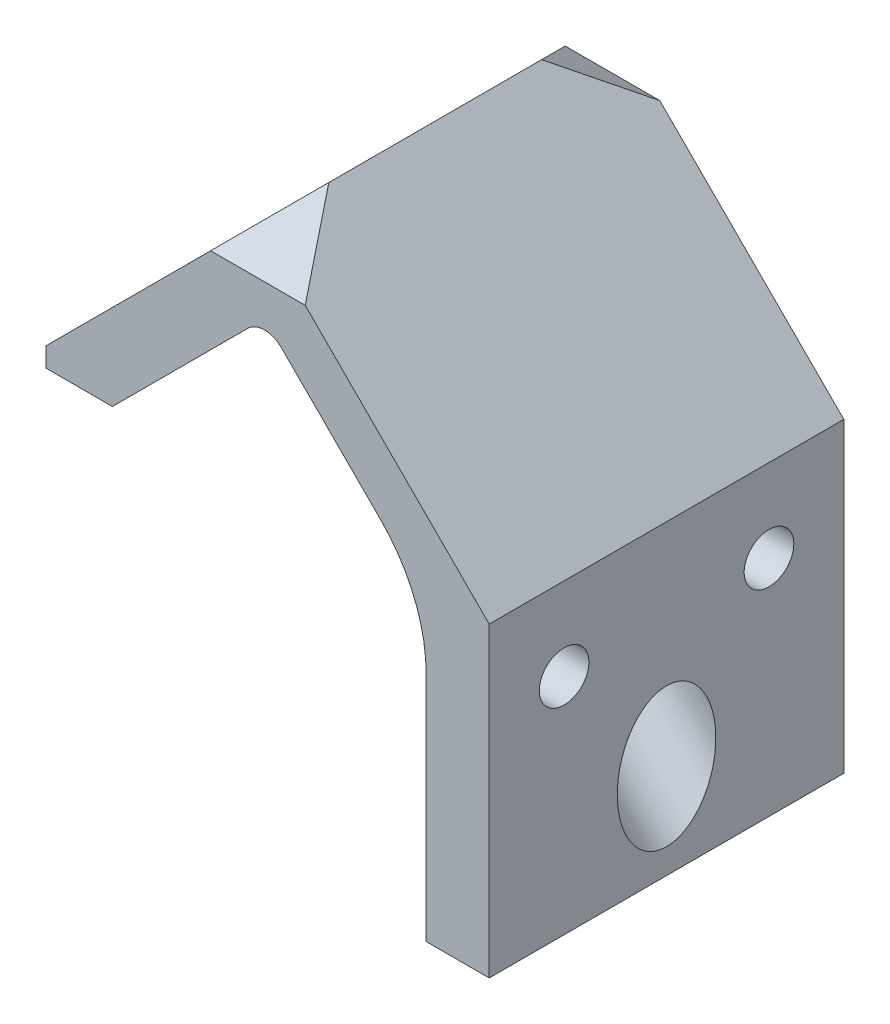
ISO-10303-21;
HEADER;
FILE_DESCRIPTION(('STEP AP214'),'2;1');
FILE_NAME('part.step','',(''),(''),'','','');
FILE_SCHEMA(('AUTOMOTIVE_DESIGN { 1 0 10303 214 1 1 1 1 }'));
ENDSEC;
DATA;
#1=APPLICATION_CONTEXT('core data for automotive mechanical design processes');
#2=APPLICATION_PROTOCOL_DEFINITION('international standard','automotive_design',2000,#1);
#3=PRODUCT_CONTEXT('',#1,'mechanical');
#4=PRODUCT('Part','Part','',(#3));
#5=PRODUCT_RELATED_PRODUCT_CATEGORY('part','',(#4));
#6=PRODUCT_DEFINITION_FORMATION('','',#4);
#7=PRODUCT_DEFINITION_CONTEXT('part definition',#1,'design');
#8=PRODUCT_DEFINITION('design','',#6,#7);
#9=PRODUCT_DEFINITION_SHAPE('','',#8);
#10=(LENGTH_UNIT() NAMED_UNIT(*) SI_UNIT(.MILLI.,.METRE.));
#11=(NAMED_UNIT(*) PLANE_ANGLE_UNIT() SI_UNIT($,.RADIAN.));
#12=(NAMED_UNIT(*) SI_UNIT($,.STERADIAN.) SOLID_ANGLE_UNIT());
#13=UNCERTAINTY_MEASURE_WITH_UNIT(LENGTH_MEASURE(1.E-05),#10,'distance_accuracy_value','');
#14=(GEOMETRIC_REPRESENTATION_CONTEXT(3) GLOBAL_UNCERTAINTY_ASSIGNED_CONTEXT((#13)) GLOBAL_UNIT_ASSIGNED_CONTEXT((#10,
#11,#12)) REPRESENTATION_CONTEXT('',''));
#15=CARTESIAN_POINT('',(0.,0.,0.));
#16=DIRECTION('',(0.,0.,1.));
#17=DIRECTION('',(1.,0.,0.));
#18=AXIS2_PLACEMENT_3D('',#15,#16,#17);
#19=CARTESIAN_POINT('',(-13.8592929112563,-5.25000000000003,4.75));
#20=DIRECTION('',(1.,0.,0.));
#21=DIRECTION('',(0.,1.,0.));
#22=AXIS2_PLACEMENT_3D('',#19,#20,#21);
#23=CYLINDRICAL_SURFACE('',#22,1.575);
#24=CARTESIAN_POINT('',(14.253048327205,-5.25000000000002,4.75));
#25=DIRECTION('',(1.,0.,0.));
#26=DIRECTION('',(0.,1.,0.));
#27=AXIS2_PLACEMENT_3D('',#24,#25,#26);
#28=CIRCLE('',#27,1.575);
#29=CARTESIAN_POINT('',(14.253048327205,-3.67500000000002,4.75));
#30=VERTEX_POINT('',#29);
#31=EDGE_CURVE('E266',#30,#30,#28,.T.);
#32=ORIENTED_EDGE('',*,*,#31,.T.);
#33=EDGE_LOOP('',(#32));
#34=FACE_BOUND('',#33,.T.);
#35=CARTESIAN_POINT('',(11.503048327205,-5.25000000000002,4.75));
#36=DIRECTION('',(-1.,0.,0.));
#37=DIRECTION('',(0.,0.,1.));
#38=AXIS2_PLACEMENT_3D('',#35,#36,#37);
#39=CIRCLE('',#38,1.575);
#40=CARTESIAN_POINT('',(11.503048327205,-5.25000000000002,6.325));
#41=VERTEX_POINT('',#40);
#42=EDGE_CURVE('E262',#41,#41,#39,.F.);
#43=ORIENTED_EDGE('',*,*,#42,.F.);
#44=EDGE_LOOP('',(#43));
#45=FACE_BOUND('',#44,.T.);
#46=ADVANCED_FACE('F35',(#34,#45),#23,.F.);
#47=CARTESIAN_POINT('',(-13.8592929112563,-5.25000000000003,17.75));
#48=DIRECTION('',(1.,0.,0.));
#49=DIRECTION('',(0.,1.,0.));
#50=AXIS2_PLACEMENT_3D('',#47,#48,#49);
#51=CYLINDRICAL_SURFACE('',#50,1.575);
#52=CARTESIAN_POINT('',(14.253048327205,-5.25000000000002,17.75));
#53=DIRECTION('',(1.,0.,0.));
#54=DIRECTION('',(0.,1.,0.));
#55=AXIS2_PLACEMENT_3D('',#52,#53,#54);
#56=CIRCLE('',#55,1.575);
#57=CARTESIAN_POINT('',(14.253048327205,-3.67500000000002,17.75));
#58=VERTEX_POINT('',#57);
#59=EDGE_CURVE('E532',#58,#58,#56,.T.);
#60=ORIENTED_EDGE('',*,*,#59,.T.);
#61=EDGE_LOOP('',(#60));
#62=FACE_BOUND('',#61,.T.);
#63=CARTESIAN_POINT('',(11.503048327205,-5.25000000000002,17.75));
#64=DIRECTION('',(-1.,0.,0.));
#65=DIRECTION('',(0.,0.,1.));
#66=AXIS2_PLACEMENT_3D('',#63,#64,#65);
#67=CIRCLE('',#66,1.575);
#68=CARTESIAN_POINT('',(11.503048327205,-5.25000000000002,19.325));
#69=VERTEX_POINT('',#68);
#70=EDGE_CURVE('E259',#69,#69,#67,.F.);
#71=ORIENTED_EDGE('',*,*,#70,.F.);
#72=EDGE_LOOP('',(#71));
#73=FACE_BOUND('',#72,.T.);
#74=ADVANCED_FACE('F366',(#62,#73),#51,.F.);
#75=CARTESIAN_POINT('',(-13.8592929112563,0.,22.5));
#76=DIRECTION('',(1.,0.,0.));
#77=DIRECTION('',(0.,0.,-1.));
#78=AXIS2_PLACEMENT_3D('',#75,#76,#77);
#79=PLANE('',#78);
#80=DIRECTION('',(0.,-1.,0.));
#81=VECTOR('',#80,1.);
#82=CARTESIAN_POINT('',(-13.8592929112563,0.,0.));
#83=LINE('',#82,#81);
#84=CARTESIAN_POINT('',(-13.8592929112563,1.24228355337243,0.));
#85=VERTEX_POINT('',#84);
#86=CARTESIAN_POINT('',(-13.8592929112563,0.,0.));
#87=VERTEX_POINT('',#86);
#88=EDGE_CURVE('E351',#85,#87,#83,.T.);
#89=ORIENTED_EDGE('',*,*,#88,.T.);
#90=DIRECTION('',(0.,0.,-1.));
#91=VECTOR('',#90,1.);
#92=CARTESIAN_POINT('',(-13.8592929112563,0.,22.5));
#93=LINE('',#92,#91);
#94=CARTESIAN_POINT('',(-13.8592929112563,0.,22.5));
#95=VERTEX_POINT('',#94);
#96=EDGE_CURVE('E255',#95,#87,#93,.T.);
#97=ORIENTED_EDGE('',*,*,#96,.F.);
#98=DIRECTION('',(0.,-1.,0.));
#99=VECTOR('',#98,1.);
#100=CARTESIAN_POINT('',(-13.8592929112563,0.,22.5));
#101=LINE('',#100,#99);
#102=CARTESIAN_POINT('',(-13.8592929112563,1.24228355337243,22.5));
#103=VERTEX_POINT('',#102);
#104=EDGE_CURVE('E327',#103,#95,#101,.T.);
#105=ORIENTED_EDGE('',*,*,#104,.F.);
#106=DIRECTION('',(0.,0.,-1.));
#107=VECTOR('',#106,1.);
#108=CARTESIAN_POINT('',(-13.8592929112563,1.24228355337243,22.5));
#109=LINE('',#108,#107);
#110=EDGE_CURVE('E238',#103,#85,#109,.T.);
#111=ORIENTED_EDGE('',*,*,#110,.T.);
#112=EDGE_LOOP('',(#89,#97,#105,#111));
#113=FACE_BOUND('',#112,.T.);
#114=ADVANCED_FACE('F372',(#113),#79,.F.);
#115=CARTESIAN_POINT('',(-9.65685424949234,0.,22.5));
#116=DIRECTION('',(0.,1.,0.));
#117=DIRECTION('',(-1.,0.,0.));
#118=AXIS2_PLACEMENT_3D('',#115,#116,#117);
#119=PLANE('',#118);
#120=DIRECTION('',(1.,0.,0.));
#121=VECTOR('',#120,1.);
#122=CARTESIAN_POINT('',(-9.65685424949234,0.,0.));
#123=LINE('',#122,#121);
#124=CARTESIAN_POINT('',(-9.65685424949234,0.,0.));
#125=VERTEX_POINT('',#124);
#126=EDGE_CURVE('E318',#87,#125,#123,.T.);
#127=ORIENTED_EDGE('',*,*,#126,.T.);
#128=DIRECTION('',(0.,0.,-1.));
#129=VECTOR('',#128,1.);
#130=CARTESIAN_POINT('',(-9.65685424949234,0.,22.5));
#131=LINE('',#130,#129);
#132=CARTESIAN_POINT('',(-9.65685424949234,0.,22.5));
#133=VERTEX_POINT('',#132);
#134=EDGE_CURVE('E252',#133,#125,#131,.T.);
#135=ORIENTED_EDGE('',*,*,#134,.F.);
#136=DIRECTION('',(1.,0.,0.));
#137=VECTOR('',#136,1.);
#138=CARTESIAN_POINT('',(-9.65685424949234,0.,22.5));
#139=LINE('',#138,#137);
#140=EDGE_CURVE('E329',#95,#133,#139,.T.);
#141=ORIENTED_EDGE('',*,*,#140,.F.);
#142=ORIENTED_EDGE('',*,*,#96,.T.);
#143=EDGE_LOOP('',(#127,#135,#141,#142));
#144=FACE_BOUND('',#143,.T.);
#145=ADVANCED_FACE('F355',(#144),#119,.F.);
#146=CARTESIAN_POINT('',(0.,9.65685424949237,22.5));
#147=DIRECTION('',(-0.707106781186549,0.707106781186546,0.));
#148=DIRECTION('',(-0.707106781186546,-0.707106781186549,0.));
#149=AXIS2_PLACEMENT_3D('',#146,#147,#148);
#150=PLANE('',#149);
#151=CARTESIAN_POINT('',(-4.41941738241592,5.23743686707644,11.25));
#152=DIRECTION('',(-0.707106781186549,0.707106781186546,0.));
#153=DIRECTION('',(-0.707106781186546,-0.707106781186549,0.));
#154=AXIS2_PLACEMENT_3D('',#151,#152,#153);
#155=CIRCLE('',#154,3.125);
#156=CARTESIAN_POINT('',(-6.62912607362387,3.02772817586848,11.25));
#157=VERTEX_POINT('',#156);
#158=EDGE_CURVE('E337',#157,#157,#155,.T.);
#159=ORIENTED_EDGE('',*,*,#158,.T.);
#160=EDGE_LOOP('',(#159));
#161=FACE_BOUND('',#160,.T.);
#162=DIRECTION('',(0.707106781186546,0.707106781186549,0.));
#163=VECTOR('',#162,1.);
#164=CARTESIAN_POINT('',(0.,9.65685424949237,0.));
#165=LINE('',#164,#163);
#166=CARTESIAN_POINT('',(-1.06066017177982,8.59619407771254,0.));
#167=VERTEX_POINT('',#166);
#168=EDGE_CURVE('E314',#125,#167,#165,.T.);
#169=ORIENTED_EDGE('',*,*,#168,.T.);
#170=DIRECTION('',(0.,0.,-1.));
#171=VECTOR('',#170,1.);
#172=CARTESIAN_POINT('',(-1.06066017177982,8.59619407771254,22.5));
#173=LINE('',#172,#171);
#174=CARTESIAN_POINT('',(-1.06066017177982,8.59619407771254,22.5));
#175=VERTEX_POINT('',#174);
#176=EDGE_CURVE('E50',#167,#175,#173,.F.);
#177=ORIENTED_EDGE('',*,*,#176,.T.);
#178=DIRECTION('',(0.707106781186546,0.707106781186549,0.));
#179=VECTOR('',#178,1.);
#180=CARTESIAN_POINT('',(0.,9.65685424949237,22.5));
#181=LINE('',#180,#179);
#182=EDGE_CURVE('E334',#133,#175,#181,.T.);
#183=ORIENTED_EDGE('',*,*,#182,.F.);
#184=ORIENTED_EDGE('',*,*,#134,.T.);
#185=EDGE_LOOP('',(#169,#177,#183,#184));
#186=FACE_BOUND('',#185,.T.);
#187=ADVANCED_FACE('F357',(#161,#186),#150,.F.);
#188=CARTESIAN_POINT('',(10.253048327205,-0.596194077712559,22.5));
#189=DIRECTION('',(0.707106781186546,0.707106781186549,0.));
#190=DIRECTION('',(-0.707106781186549,0.707106781186546,0.));
#191=AXIS2_PLACEMENT_3D('',#188,#189,#190);
#192=PLANE('',#191);
#193=DIRECTION('',(0.707106781186549,-0.707106781186547,0.));
#194=VECTOR('',#193,1.);
#195=CARTESIAN_POINT('',(10.253048327205,-0.596194077712559,22.5));
#196=LINE('',#195,#194);
#197=CARTESIAN_POINT('',(1.06066017177982,8.59619407771255,22.5));
#198=VERTEX_POINT('',#197);
#199=CARTESIAN_POINT('',(7.32411613907041,2.33273811042197,22.5));
#200=VERTEX_POINT('',#199);
#201=EDGE_CURVE('E305',#198,#200,#196,.T.);
#202=ORIENTED_EDGE('',*,*,#201,.F.);
#203=DIRECTION('',(0.,0.,-1.));
#204=VECTOR('',#203,1.);
#205=CARTESIAN_POINT('',(1.06066017177982,8.59619407771255,0.));
#206=LINE('',#205,#204);
#207=CARTESIAN_POINT('',(1.06066017177982,8.59619407771255,0.));
#208=VERTEX_POINT('',#207);
#209=EDGE_CURVE('E297',#198,#208,#206,.T.);
#210=ORIENTED_EDGE('',*,*,#209,.T.);
#211=DIRECTION('',(0.707106781186549,-0.707106781186547,0.));
#212=VECTOR('',#211,1.);
#213=CARTESIAN_POINT('',(10.253048327205,-0.596194077712559,0.));
#214=LINE('',#213,#212);
#215=CARTESIAN_POINT('',(7.32411613907041,2.33273811042197,0.));
#216=VERTEX_POINT('',#215);
#217=EDGE_CURVE('E304',#208,#216,#214,.T.);
#218=ORIENTED_EDGE('',*,*,#217,.T.);
#219=DIRECTION('',(0.,0.,-1.));
#220=VECTOR('',#219,1.);
#221=CARTESIAN_POINT('',(7.32411613907041,2.33273811042197,22.5));
#222=LINE('',#221,#220);
#223=EDGE_CURVE('E273',#216,#200,#222,.F.);
#224=ORIENTED_EDGE('',*,*,#223,.T.);
#225=EDGE_LOOP('',(#202,#210,#218,#224));
#226=FACE_BOUND('',#225,.T.);
#227=ADVANCED_FACE('F303',(#226),#192,.F.);
#228=CARTESIAN_POINT('',(10.2530483272049,-19.4461940777126,22.5));
#229=DIRECTION('',(1.,0.,0.));
#230=DIRECTION('',(0.,1.,0.));
#231=AXIS2_PLACEMENT_3D('',#228,#229,#230);
#232=PLANE('',#231);
#233=DIRECTION('',(0.,-1.,0.));
#234=VECTOR('',#233,1.);
#235=CARTESIAN_POINT('',(10.2530483272049,-19.4461940777126,22.5));
#236=LINE('',#235,#234);
#237=CARTESIAN_POINT('',(10.2530483272049,-4.73832970144353,22.5));
#238=VERTEX_POINT('',#237);
#239=CARTESIAN_POINT('',(10.2530483272049,-19.4461940777126,22.5));
#240=VERTEX_POINT('',#239);
#241=EDGE_CURVE('E342',#238,#240,#236,.T.);
#242=ORIENTED_EDGE('',*,*,#241,.F.);
#243=DIRECTION('',(0.,0.,-1.));
#244=VECTOR('',#243,1.);
#245=CARTESIAN_POINT('',(10.2530483272049,-4.73832970144353,0.));
#246=LINE('',#245,#244);
#247=CARTESIAN_POINT('',(10.253048327205,-4.73832970144353,20.630013495935));
#248=VERTEX_POINT('',#247);
#249=EDGE_CURVE('E270',#238,#248,#246,.T.);
#250=ORIENTED_EDGE('',*,*,#249,.T.);
#251=DIRECTION('',(0.,0.866025403784439,-0.5));
#252=VECTOR('',#251,1.);
#253=CARTESIAN_POINT('',(10.253048327205,-5.25000000000001,20.9254264805429));
#254=LINE('',#253,#252);
#255=CARTESIAN_POINT('',(10.253048327205,-5.25000000000001,20.9254264805429));
#256=VERTEX_POINT('',#255);
#257=EDGE_CURVE('E513',#256,#248,#254,.T.);
#258=ORIENTED_EDGE('',*,*,#257,.F.);
#259=DIRECTION('',(0.,0.866025403784439,0.499999999999999));
#260=VECTOR('',#259,1.);
#261=CARTESIAN_POINT('',(10.253048327205,-8.00000000000002,19.3377132402715));
#262=LINE('',#261,#260);
#263=CARTESIAN_POINT('',(10.2530483272049,-8.00000000000002,19.3377132402715));
#264=VERTEX_POINT('',#263);
#265=EDGE_CURVE('E510',#264,#256,#262,.T.);
#266=ORIENTED_EDGE('',*,*,#265,.F.);
#267=DIRECTION('',(0.,0.,1.));
#268=VECTOR('',#267,1.);
#269=CARTESIAN_POINT('',(10.253048327205,-8.00000000000002,16.1622867597285));
#270=LINE('',#269,#268);
#271=CARTESIAN_POINT('',(10.253048327205,-8.00000000000002,16.1622867597285));
#272=VERTEX_POINT('',#271);
#273=EDGE_CURVE('E444',#272,#264,#270,.T.);
#274=ORIENTED_EDGE('',*,*,#273,.F.);
#275=DIRECTION('',(0.,-0.866025403784439,0.5));
#276=VECTOR('',#275,1.);
#277=CARTESIAN_POINT('',(10.253048327205,-5.25000000000002,14.5745735194571));
#278=LINE('',#277,#276);
#279=CARTESIAN_POINT('',(10.253048327205,-5.25000000000002,14.5745735194571));
#280=VERTEX_POINT('',#279);
#281=EDGE_CURVE('E493',#280,#272,#278,.T.);
#282=ORIENTED_EDGE('',*,*,#281,.F.);
#283=DIRECTION('',(0.,-0.866025403784439,-0.5));
#284=VECTOR('',#283,1.);
#285=CARTESIAN_POINT('',(10.253048327205,-2.50000000000001,16.1622867597285));
#286=LINE('',#285,#284);
#287=CARTESIAN_POINT('',(10.253048327205,-4.73832970144353,14.869986504065));
#288=VERTEX_POINT('',#287);
#289=EDGE_CURVE('E516',#288,#280,#286,.T.);
#290=ORIENTED_EDGE('',*,*,#289,.F.);
#291=DIRECTION('',(0.,0.,-1.));
#292=VECTOR('',#291,1.);
#293=CARTESIAN_POINT('',(10.2530483272049,-4.73832970144353,0.));
#294=LINE('',#293,#292);
#295=CARTESIAN_POINT('',(10.253048327205,-4.73832970144353,7.63001349593502));
#296=VERTEX_POINT('',#295);
#297=EDGE_CURVE('E268',#288,#296,#294,.T.);
#298=ORIENTED_EDGE('',*,*,#297,.T.);
#299=DIRECTION('',(0.,0.866025403784439,-0.5));
#300=VECTOR('',#299,1.);
#301=CARTESIAN_POINT('',(10.253048327205,-5.25000000000001,7.92542648054294));
#302=LINE('',#301,#300);
#303=CARTESIAN_POINT('',(10.253048327205,-5.25000000000001,7.92542648054294));
#304=VERTEX_POINT('',#303);
#305=EDGE_CURVE('E471',#304,#296,#302,.T.);
#306=ORIENTED_EDGE('',*,*,#305,.F.);
#307=DIRECTION('',(0.,0.866025403784439,0.5));
#308=VECTOR('',#307,1.);
#309=CARTESIAN_POINT('',(10.253048327205,-8.00000000000002,6.33771324027147));
#310=LINE('',#309,#308);
#311=CARTESIAN_POINT('',(10.2530483272049,-8.00000000000002,6.33771324027147));
#312=VERTEX_POINT('',#311);
#313=EDGE_CURVE('E467',#312,#304,#310,.T.);
#314=ORIENTED_EDGE('',*,*,#313,.F.);
#315=DIRECTION('',(0.,0.,1.));
#316=VECTOR('',#315,1.);
#317=CARTESIAN_POINT('',(10.253048327205,-8.00000000000002,3.16228675972853));
#318=LINE('',#317,#316);
#319=CARTESIAN_POINT('',(10.253048327205,-8.00000000000002,3.16228675972853));
#320=VERTEX_POINT('',#319);
#321=EDGE_CURVE('E465',#320,#312,#318,.T.);
#322=ORIENTED_EDGE('',*,*,#321,.F.);
#323=DIRECTION('',(0.,-0.866025403784439,0.5));
#324=VECTOR('',#323,1.);
#325=CARTESIAN_POINT('',(10.253048327205,-5.25000000000001,1.57457351945706));
#326=LINE('',#325,#324);
#327=CARTESIAN_POINT('',(10.253048327205,-5.25000000000001,1.57457351945706));
#328=VERTEX_POINT('',#327);
#329=EDGE_CURVE('E449',#328,#320,#326,.T.);
#330=ORIENTED_EDGE('',*,*,#329,.F.);
#331=DIRECTION('',(0.,-0.866025403784439,-0.5));
#332=VECTOR('',#331,1.);
#333=CARTESIAN_POINT('',(10.253048327205,-2.50000000000001,3.16228675972853));
#334=LINE('',#333,#332);
#335=CARTESIAN_POINT('',(10.253048327205,-4.73832970144353,1.86998650406498));
#336=VERTEX_POINT('',#335);
#337=EDGE_CURVE('E436',#336,#328,#334,.T.);
#338=ORIENTED_EDGE('',*,*,#337,.F.);
#339=DIRECTION('',(0.,0.,-1.));
#340=VECTOR('',#339,1.);
#341=CARTESIAN_POINT('',(10.2530483272049,-4.73832970144353,0.));
#342=LINE('',#341,#340);
#343=CARTESIAN_POINT('',(10.2530483272049,-4.73832970144353,0.));
#344=VERTEX_POINT('',#343);
#345=EDGE_CURVE('E258',#336,#344,#342,.T.);
#346=ORIENTED_EDGE('',*,*,#345,.T.);
#347=DIRECTION('',(0.,-1.,0.));
#348=VECTOR('',#347,1.);
#349=CARTESIAN_POINT('',(10.2530483272049,-19.4461940777126,0.));
#350=LINE('',#349,#348);
#351=CARTESIAN_POINT('',(10.2530483272049,-19.4461940777126,0.));
#352=VERTEX_POINT('',#351);
#353=EDGE_CURVE('E313',#344,#352,#350,.T.);
#354=ORIENTED_EDGE('',*,*,#353,.T.);
#355=DIRECTION('',(0.,0.,-1.));
#356=VECTOR('',#355,1.);
#357=CARTESIAN_POINT('',(10.2530483272049,-19.4461940777126,22.5));
#358=LINE('',#357,#356);
#359=EDGE_CURVE('E249',#240,#352,#358,.T.);
#360=ORIENTED_EDGE('',*,*,#359,.F.);
#361=EDGE_LOOP('',(#242,#250,#258,#266,#274,#282,#290,#298,#306,#314,#322,#330,#338,#346,#354,#360));
#362=FACE_BOUND('',#361,.T.);
#363=CARTESIAN_POINT('',(10.2530483272049,-9.43502884254437,11.25));
#364=DIRECTION('',(1.,0.,0.));
#365=DIRECTION('',(0.,1.,0.));
#366=AXIS2_PLACEMENT_3D('',#363,#364,#365);
#367=ELLIPSE('',#366,4.41941738241591,3.125);
#368=CARTESIAN_POINT('',(10.2530483272049,-5.01561146012847,11.25));
#369=VERTEX_POINT('',#368);
#370=EDGE_CURVE('E541',#369,#369,#367,.T.);
#371=ORIENTED_EDGE('',*,*,#370,.T.);
#372=EDGE_LOOP('',(#371));
#373=FACE_BOUND('',#372,.T.);
#374=ADVANCED_FACE('F400',(#362,#373),#232,.F.);
#375=CARTESIAN_POINT('',(14.2530483272049,-19.4461940777126,22.5));
#376=DIRECTION('',(0.,1.,0.));
#377=DIRECTION('',(0.,0.,1.));
#378=AXIS2_PLACEMENT_3D('',#375,#376,#377);
#379=PLANE('',#378);
#380=DIRECTION('',(1.,0.,0.));
#381=VECTOR('',#380,1.);
#382=CARTESIAN_POINT('',(14.2530483272049,-19.4461940777126,0.));
#383=LINE('',#382,#381);
#384=CARTESIAN_POINT('',(14.2530483272049,-19.4461940777126,0.));
#385=VERTEX_POINT('',#384);
#386=EDGE_CURVE('E316',#352,#385,#383,.T.);
#387=ORIENTED_EDGE('',*,*,#386,.T.);
#388=DIRECTION('',(0.,0.,-1.));
#389=VECTOR('',#388,1.);
#390=CARTESIAN_POINT('',(14.2530483272049,-19.4461940777126,22.5));
#391=LINE('',#390,#389);
#392=CARTESIAN_POINT('',(14.2530483272049,-19.4461940777126,22.5));
#393=VERTEX_POINT('',#392);
#394=EDGE_CURVE('E241',#393,#385,#391,.T.);
#395=ORIENTED_EDGE('',*,*,#394,.F.);
#396=DIRECTION('',(1.,0.,0.));
#397=VECTOR('',#396,1.);
#398=CARTESIAN_POINT('',(14.2530483272049,-19.4461940777126,22.5));
#399=LINE('',#398,#397);
#400=EDGE_CURVE('E344',#240,#393,#399,.T.);
#401=ORIENTED_EDGE('',*,*,#400,.F.);
#402=ORIENTED_EDGE('',*,*,#359,.T.);
#403=EDGE_LOOP('',(#387,#395,#401,#402));
#404=FACE_BOUND('',#403,.T.);
#405=ADVANCED_FACE('F396',(#404),#379,.F.);
#406=CARTESIAN_POINT('',(14.253048327205,0.,22.5));
#407=DIRECTION('',(-1.,0.,0.));
#408=DIRECTION('',(0.,-1.,0.));
#409=AXIS2_PLACEMENT_3D('',#406,#407,#408);
#410=PLANE('',#409);
#411=ORIENTED_EDGE('',*,*,#59,.F.);
#412=EDGE_LOOP('',(#411));
#413=FACE_BOUND('',#412,.T.);
#414=ORIENTED_EDGE('',*,*,#31,.F.);
#415=EDGE_LOOP('',(#414));
#416=FACE_BOUND('',#415,.T.);
#417=CARTESIAN_POINT('',(14.2530483272049,-13.4350288425444,11.25));
#418=DIRECTION('',(-1.,0.,0.));
#419=DIRECTION('',(0.,1.,0.));
#420=AXIS2_PLACEMENT_3D('',#417,#418,#419);
#421=ELLIPSE('',#420,4.41941738241591,3.125);
#422=CARTESIAN_POINT('',(14.2530483272049,-9.01561146012845,11.25));
#423=VERTEX_POINT('',#422);
#424=EDGE_CURVE('E539',#423,#423,#421,.T.);
#425=ORIENTED_EDGE('',*,*,#424,.T.);
#426=EDGE_LOOP('',(#425));
#427=FACE_BOUND('',#426,.T.);
#428=DIRECTION('',(0.,1.,0.));
#429=VECTOR('',#428,1.);
#430=CARTESIAN_POINT('',(14.253048327205,0.,0.));
#431=LINE('',#430,#429);
#432=CARTESIAN_POINT('',(14.253048327205,0.,0.));
#433=VERTEX_POINT('',#432);
#434=EDGE_CURVE('E323',#385,#433,#431,.T.);
#435=ORIENTED_EDGE('',*,*,#434,.T.);
#436=DIRECTION('',(0.,0.,-1.));
#437=VECTOR('',#436,1.);
#438=CARTESIAN_POINT('',(14.253048327205,0.,22.5));
#439=LINE('',#438,#437);
#440=CARTESIAN_POINT('',(14.253048327205,0.,22.5));
#441=VERTEX_POINT('',#440);
#442=EDGE_CURVE('E237',#441,#433,#439,.T.);
#443=ORIENTED_EDGE('',*,*,#442,.F.);
#444=DIRECTION('',(0.,1.,0.));
#445=VECTOR('',#444,1.);
#446=CARTESIAN_POINT('',(14.253048327205,0.,22.5));
#447=LINE('',#446,#445);
#448=EDGE_CURVE('E346',#393,#441,#447,.T.);
#449=ORIENTED_EDGE('',*,*,#448,.F.);
#450=ORIENTED_EDGE('',*,*,#394,.T.);
#451=EDGE_LOOP('',(#435,#443,#449,#450));
#452=FACE_BOUND('',#451,.T.);
#453=ADVANCED_FACE('F393',(#413,#416,#427,#452),#410,.F.);
#454=CARTESIAN_POINT('',(-0.424264068711931,14.6773123959169,22.5));
#455=DIRECTION('',(-0.707106781186547,-0.707106781186548,0.));
#456=DIRECTION('',(0.707106781186548,-0.707106781186547,0.));
#457=AXIS2_PLACEMENT_3D('',#454,#455,#456);
#458=PLANE('',#457);
#459=DIRECTION('',(0.,0.,-1.));
#460=VECTOR('',#459,1.);
#461=CARTESIAN_POINT('',(-0.424264068711931,14.6773123959169,22.5));
#462=LINE('',#461,#460);
#463=CARTESIAN_POINT('',(-0.424264068711939,14.6773123959169,18.));
#464=VERTEX_POINT('',#463);
#465=CARTESIAN_POINT('',(-0.424264068711939,14.6773123959169,4.5));
#466=VERTEX_POINT('',#465);
#467=EDGE_CURVE('E228',#464,#466,#462,.T.);
#468=ORIENTED_EDGE('',*,*,#467,.F.);
#469=DIRECTION('',(-0.485071250072671,0.485071250072665,-0.727606875108997));
#470=VECTOR('',#469,1.);
#471=CARTESIAN_POINT('',(-0.424264068711939,14.6773123959169,18.));
#472=LINE('',#471,#470);
#473=CARTESIAN_POINT('',(2.5757359312881,11.6773123959169,22.5));
#474=VERTEX_POINT('',#473);
#475=EDGE_CURVE('E213',#474,#464,#472,.T.);
#476=ORIENTED_EDGE('',*,*,#475,.F.);
#477=DIRECTION('',(-0.707106781186548,0.707106781186547,0.));
#478=VECTOR('',#477,1.);
#479=CARTESIAN_POINT('',(-0.424264068711931,14.6773123959169,22.5));
#480=LINE('',#479,#478);
#481=EDGE_CURVE('E348',#441,#474,#480,.T.);
#482=ORIENTED_EDGE('',*,*,#481,.F.);
#483=ORIENTED_EDGE('',*,*,#442,.T.);
#484=DIRECTION('',(-0.707106781186548,0.707106781186547,0.));
#485=VECTOR('',#484,1.);
#486=CARTESIAN_POINT('',(-0.424264068711931,14.6773123959169,0.));
#487=LINE('',#486,#485);
#488=CARTESIAN_POINT('',(2.57573593128807,11.6773123959169,0.));
#489=VERTEX_POINT('',#488);
#490=EDGE_CURVE('E325',#433,#489,#487,.T.);
#491=ORIENTED_EDGE('',*,*,#490,.T.);
#492=DIRECTION('',(-0.485071250072671,0.485071250072665,0.727606875108997));
#493=VECTOR('',#492,1.);
#494=CARTESIAN_POINT('',(-0.424264068711939,14.6773123959169,4.5));
#495=LINE('',#494,#493);
#496=EDGE_CURVE('E236',#489,#466,#495,.T.);
#497=ORIENTED_EDGE('',*,*,#496,.T.);
#498=EDGE_LOOP('',(#468,#476,#482,#483,#491,#497));
#499=FACE_BOUND('',#498,.T.);
#500=ADVANCED_FACE('F234',(#499),#458,.F.);
#501=CARTESIAN_POINT('',(-13.8592929112563,1.24228355337243,22.5));
#502=DIRECTION('',(0.707106781186549,-0.707106781186546,0.));
#503=DIRECTION('',(0.707106781186546,0.707106781186549,0.));
#504=AXIS2_PLACEMENT_3D('',#501,#502,#503);
#505=PLANE('',#504);
#506=CARTESIAN_POINT('',(-7.14177848998413,7.95979797464465,11.25));
#507=DIRECTION('',(-0.707106781186549,0.707106781186546,0.));
#508=DIRECTION('',(-0.707106781186546,-0.707106781186549,0.));
#509=AXIS2_PLACEMENT_3D('',#506,#507,#508);
#510=CIRCLE('',#509,3.125);
#511=CARTESIAN_POINT('',(-9.35148718119208,5.75008928343668,11.25));
#512=VERTEX_POINT('',#511);
#513=EDGE_CURVE('E535',#512,#512,#510,.T.);
#514=ORIENTED_EDGE('',*,*,#513,.F.);
#515=EDGE_LOOP('',(#514));
#516=FACE_BOUND('',#515,.T.);
#517=DIRECTION('',(-0.707106781186546,-0.707106781186549,0.));
#518=VECTOR('',#517,1.);
#519=CARTESIAN_POINT('',(-13.8592929112563,1.24228355337243,22.5));
#520=LINE('',#519,#518);
#521=CARTESIAN_POINT('',(-3.42426406871191,11.6773123959169,22.5));
#522=VERTEX_POINT('',#521);
#523=EDGE_CURVE('E231',#522,#103,#520,.T.);
#524=ORIENTED_EDGE('',*,*,#523,.F.);
#525=DIRECTION('',(-0.485071250072665,-0.485071250072666,0.727606875108999));
#526=VECTOR('',#525,1.);
#527=CARTESIAN_POINT('',(-3.42426406871193,11.6773123959169,22.5));
#528=LINE('',#527,#526);
#529=EDGE_CURVE('E216',#464,#522,#528,.T.);
#530=ORIENTED_EDGE('',*,*,#529,.F.);
#531=ORIENTED_EDGE('',*,*,#467,.T.);
#532=DIRECTION('',(-0.485071250072665,-0.485071250072666,-0.727606875108999));
#533=VECTOR('',#532,1.);
#534=CARTESIAN_POINT('',(-3.42426406871193,11.6773123959169,0.));
#535=LINE('',#534,#533);
#536=CARTESIAN_POINT('',(-3.42426406871193,11.6773123959169,0.));
#537=VERTEX_POINT('',#536);
#538=EDGE_CURVE('E421',#466,#537,#535,.T.);
#539=ORIENTED_EDGE('',*,*,#538,.T.);
#540=DIRECTION('',(-0.707106781186546,-0.707106781186549,0.));
#541=VECTOR('',#540,1.);
#542=CARTESIAN_POINT('',(-13.8592929112563,1.24228355337243,0.));
#543=LINE('',#542,#541);
#544=EDGE_CURVE('E326',#537,#85,#543,.T.);
#545=ORIENTED_EDGE('',*,*,#544,.T.);
#546=ORIENTED_EDGE('',*,*,#110,.F.);
#547=EDGE_LOOP('',(#524,#530,#531,#539,#545,#546));
#548=FACE_BOUND('',#547,.T.);
#549=ADVANCED_FACE('F226',(#516,#548),#505,.F.);
#550=CARTESIAN_POINT('',(0.,0.,22.5));
#551=DIRECTION('',(0.,0.,1.));
#552=DIRECTION('',(1.,0.,0.));
#553=AXIS2_PLACEMENT_3D('',#550,#551,#552);
#554=PLANE('',#553);
#555=DIRECTION('',(1.,0.,0.));
#556=VECTOR('',#555,1.);
#557=CARTESIAN_POINT('',(2.5757359312881,11.6773123959169,22.5));
#558=LINE('',#557,#556);
#559=EDGE_CURVE('E218',#522,#474,#558,.T.);
#560=ORIENTED_EDGE('',*,*,#559,.F.);
#561=ORIENTED_EDGE('',*,*,#523,.T.);
#562=ORIENTED_EDGE('',*,*,#104,.T.);
#563=ORIENTED_EDGE('',*,*,#140,.T.);
#564=ORIENTED_EDGE('',*,*,#182,.T.);
#565=CARTESIAN_POINT('',(0.,7.53553390593273,22.5));
#566=DIRECTION('',(0.,0.,1.));
#567=DIRECTION('',(1.,0.,0.));
#568=AXIS2_PLACEMENT_3D('',#565,#566,#567);
#569=CIRCLE('',#568,1.5);
#570=EDGE_CURVE('E11',#175,#198,#569,.F.);
#571=ORIENTED_EDGE('',*,*,#570,.T.);
#572=ORIENTED_EDGE('',*,*,#201,.T.);
#573=CARTESIAN_POINT('',(0.25304832720495,-4.73832970144351,22.5));
#574=DIRECTION('',(0.,0.,1.));
#575=DIRECTION('',(1.,0.,0.));
#576=AXIS2_PLACEMENT_3D('',#573,#574,#575);
#577=CIRCLE('',#576,10.);
#578=EDGE_CURVE('E295',#200,#238,#577,.F.);
#579=ORIENTED_EDGE('',*,*,#578,.T.);
#580=ORIENTED_EDGE('',*,*,#241,.T.);
#581=ORIENTED_EDGE('',*,*,#400,.T.);
#582=ORIENTED_EDGE('',*,*,#448,.T.);
#583=ORIENTED_EDGE('',*,*,#481,.T.);
#584=EDGE_LOOP('',(#560,#561,#562,#563,#564,#571,#572,#579,#580,#581,#582,#583));
#585=FACE_BOUND('',#584,.T.);
#586=ADVANCED_FACE('F358',(#585),#554,.T.);
#587=CARTESIAN_POINT('',(0.,0.,0.));
#588=DIRECTION('',(0.,0.,1.));
#589=DIRECTION('',(1.,0.,0.));
#590=AXIS2_PLACEMENT_3D('',#587,#588,#589);
#591=PLANE('',#590);
#592=ORIENTED_EDGE('',*,*,#544,.F.);
#593=DIRECTION('',(1.,0.,0.));
#594=VECTOR('',#593,1.);
#595=CARTESIAN_POINT('',(2.5757359312881,11.6773123959169,0.));
#596=LINE('',#595,#594);
#597=EDGE_CURVE('E418',#537,#489,#596,.T.);
#598=ORIENTED_EDGE('',*,*,#597,.T.);
#599=ORIENTED_EDGE('',*,*,#490,.F.);
#600=ORIENTED_EDGE('',*,*,#434,.F.);
#601=ORIENTED_EDGE('',*,*,#386,.F.);
#602=ORIENTED_EDGE('',*,*,#353,.F.);
#603=CARTESIAN_POINT('',(0.25304832720495,-4.73832970144351,0.));
#604=DIRECTION('',(0.,0.,1.));
#605=DIRECTION('',(1.,0.,0.));
#606=AXIS2_PLACEMENT_3D('',#603,#604,#605);
#607=CIRCLE('',#606,10.);
#608=EDGE_CURVE('E292',#344,#216,#607,.T.);
#609=ORIENTED_EDGE('',*,*,#608,.T.);
#610=ORIENTED_EDGE('',*,*,#217,.F.);
#611=CARTESIAN_POINT('',(0.,7.53553390593273,0.));
#612=DIRECTION('',(0.,0.,1.));
#613=DIRECTION('',(1.,0.,0.));
#614=AXIS2_PLACEMENT_3D('',#611,#612,#613);
#615=CIRCLE('',#614,1.5);
#616=EDGE_CURVE('E43',#208,#167,#615,.T.);
#617=ORIENTED_EDGE('',*,*,#616,.T.);
#618=ORIENTED_EDGE('',*,*,#168,.F.);
#619=ORIENTED_EDGE('',*,*,#126,.F.);
#620=ORIENTED_EDGE('',*,*,#88,.F.);
#621=EDGE_LOOP('',(#592,#598,#599,#600,#601,#602,#609,#610,#617,#618,#619,#620));
#622=FACE_BOUND('',#621,.T.);
#623=ADVANCED_FACE('F309',(#622),#591,.F.);
#624=CARTESIAN_POINT('',(17.258630944789,-16.4406114601285,11.25));
#625=DIRECTION('',(-0.707106781186549,0.707106781186547,0.));
#626=DIRECTION('',(-0.707106781186546,-0.707106781186549,0.));
#627=AXIS2_PLACEMENT_3D('',#624,#625,#626);
#628=CYLINDRICAL_SURFACE('',#627,3.125);
#629=ORIENTED_EDGE('',*,*,#513,.T.);
#630=EDGE_LOOP('',(#629));
#631=FACE_BOUND('',#630,.T.);
#632=ORIENTED_EDGE('',*,*,#158,.F.);
#633=EDGE_LOOP('',(#632));
#634=FACE_BOUND('',#633,.T.);
#635=ADVANCED_FACE('F379',(#631,#634),#628,.F.);
#636=ORIENTED_EDGE('',*,*,#424,.F.);
#637=EDGE_LOOP('',(#636));
#638=FACE_BOUND('',#637,.T.);
#639=ORIENTED_EDGE('',*,*,#370,.F.);
#640=EDGE_LOOP('',(#639));
#641=FACE_BOUND('',#640,.T.);
#642=ADVANCED_FACE('F382',(#638,#641),#628,.F.);
#643=CARTESIAN_POINT('',(11.503048327205,0.,0.));
#644=DIRECTION('',(-1.,0.,0.));
#645=DIRECTION('',(0.,0.,1.));
#646=AXIS2_PLACEMENT_3D('',#643,#644,#645);
#647=PLANE('',#646);
#648=DIRECTION('',(0.,0.,1.));
#649=VECTOR('',#648,1.);
#650=CARTESIAN_POINT('',(11.503048327205,-8.00000000000002,16.1622867597285));
#651=LINE('',#650,#649);
#652=CARTESIAN_POINT('',(11.503048327205,-8.00000000000002,16.1622867597285));
#653=VERTEX_POINT('',#652);
#654=CARTESIAN_POINT('',(11.503048327205,-8.00000000000002,19.3377132402715));
#655=VERTEX_POINT('',#654);
#656=EDGE_CURVE('E489',#653,#655,#651,.T.);
#657=ORIENTED_EDGE('',*,*,#656,.T.);
#658=DIRECTION('',(0.,0.866025403784439,0.499999999999999));
#659=VECTOR('',#658,1.);
#660=CARTESIAN_POINT('',(11.503048327205,-8.00000000000002,19.3377132402715));
#661=LINE('',#660,#659);
#662=CARTESIAN_POINT('',(11.503048327205,-5.25000000000001,20.9254264805429));
#663=VERTEX_POINT('',#662);
#664=EDGE_CURVE('E492',#655,#663,#661,.T.);
#665=ORIENTED_EDGE('',*,*,#664,.T.);
#666=DIRECTION('',(0.,0.866025403784439,-0.5));
#667=VECTOR('',#666,1.);
#668=CARTESIAN_POINT('',(11.503048327205,-5.25000000000001,20.9254264805429));
#669=LINE('',#668,#667);
#670=CARTESIAN_POINT('',(11.503048327205,-2.50000000000001,19.3377132402715));
#671=VERTEX_POINT('',#670);
#672=EDGE_CURVE('E496',#663,#671,#669,.T.);
#673=ORIENTED_EDGE('',*,*,#672,.T.);
#674=DIRECTION('',(0.,0.,-1.));
#675=VECTOR('',#674,1.);
#676=CARTESIAN_POINT('',(11.503048327205,-2.50000000000001,19.3377132402715));
#677=LINE('',#676,#675);
#678=CARTESIAN_POINT('',(11.503048327205,-2.50000000000001,16.1622867597285));
#679=VERTEX_POINT('',#678);
#680=EDGE_CURVE('E499',#671,#679,#677,.T.);
#681=ORIENTED_EDGE('',*,*,#680,.T.);
#682=DIRECTION('',(0.,-0.866025403784439,-0.5));
#683=VECTOR('',#682,1.);
#684=CARTESIAN_POINT('',(11.503048327205,-2.50000000000001,16.1622867597285));
#685=LINE('',#684,#683);
#686=CARTESIAN_POINT('',(11.503048327205,-5.25000000000002,14.5745735194571));
#687=VERTEX_POINT('',#686);
#688=EDGE_CURVE('E502',#679,#687,#685,.T.);
#689=ORIENTED_EDGE('',*,*,#688,.T.);
#690=DIRECTION('',(0.,-0.866025403784439,0.5));
#691=VECTOR('',#690,1.);
#692=CARTESIAN_POINT('',(11.503048327205,-5.25000000000002,14.5745735194571));
#693=LINE('',#692,#691);
#694=EDGE_CURVE('E505',#687,#653,#693,.T.);
#695=ORIENTED_EDGE('',*,*,#694,.T.);
#696=EDGE_LOOP('',(#657,#665,#673,#681,#689,#695));
#697=FACE_BOUND('',#696,.T.);
#698=ORIENTED_EDGE('',*,*,#70,.T.);
#699=EDGE_LOOP('',(#698));
#700=FACE_BOUND('',#699,.T.);
#701=ADVANCED_FACE('F549',(#697,#700),#647,.T.);
#702=CARTESIAN_POINT('',(11.503048327205,-8.00000000000002,16.1622867597285));
#703=DIRECTION('',(0.,-1.,0.));
#704=DIRECTION('',(0.,0.,-1.));
#705=AXIS2_PLACEMENT_3D('',#702,#703,#704);
#706=PLANE('',#705);
#707=ORIENTED_EDGE('',*,*,#273,.T.);
#708=DIRECTION('',(-1.,0.,0.));
#709=VECTOR('',#708,1.);
#710=CARTESIAN_POINT('',(11.503048327205,-8.00000000000002,19.3377132402715));
#711=LINE('',#710,#709);
#712=EDGE_CURVE('E508',#655,#264,#711,.T.);
#713=ORIENTED_EDGE('',*,*,#712,.F.);
#714=ORIENTED_EDGE('',*,*,#656,.F.);
#715=DIRECTION('',(-1.,0.,0.));
#716=VECTOR('',#715,1.);
#717=CARTESIAN_POINT('',(11.503048327205,-8.00000000000002,16.1622867597285));
#718=LINE('',#717,#716);
#719=EDGE_CURVE('E468',#653,#272,#718,.T.);
#720=ORIENTED_EDGE('',*,*,#719,.T.);
#721=EDGE_LOOP('',(#707,#713,#714,#720));
#722=FACE_BOUND('',#721,.T.);
#723=ADVANCED_FACE('F554',(#722),#706,.F.);
#724=CARTESIAN_POINT('',(11.503048327205,-5.25000000000002,14.5745735194571));
#725=DIRECTION('',(0.,-0.5,-0.866025403784439));
#726=DIRECTION('',(0.,0.866025403784439,-0.5));
#727=AXIS2_PLACEMENT_3D('',#724,#725,#726);
#728=PLANE('',#727);
#729=ORIENTED_EDGE('',*,*,#281,.T.);
#730=ORIENTED_EDGE('',*,*,#719,.F.);
#731=ORIENTED_EDGE('',*,*,#694,.F.);
#732=DIRECTION('',(-1.,0.,0.));
#733=VECTOR('',#732,1.);
#734=CARTESIAN_POINT('',(11.503048327205,-5.25000000000002,14.5745735194571));
#735=LINE('',#734,#733);
#736=EDGE_CURVE('E521',#687,#280,#735,.T.);
#737=ORIENTED_EDGE('',*,*,#736,.T.);
#738=EDGE_LOOP('',(#729,#730,#731,#737));
#739=FACE_BOUND('',#738,.T.);
#740=ADVANCED_FACE('F562',(#739),#728,.F.);
#741=CARTESIAN_POINT('',(11.503048327205,-2.50000000000001,16.1622867597285));
#742=DIRECTION('',(0.,0.5,-0.866025403784439));
#743=DIRECTION('',(0.,0.866025403784439,0.5));
#744=AXIS2_PLACEMENT_3D('',#741,#742,#743);
#745=PLANE('',#744);
#746=DIRECTION('',(-1.,0.,0.));
#747=VECTOR('',#746,1.);
#748=CARTESIAN_POINT('',(11.503048327205,-2.50000000000001,16.1622867597285));
#749=LINE('',#748,#747);
#750=CARTESIAN_POINT('',(9.99932352071533,-2.50000000000001,16.1622867597285));
#751=VERTEX_POINT('',#750);
#752=EDGE_CURVE('E524',#679,#751,#749,.T.);
#753=ORIENTED_EDGE('',*,*,#752,.T.);
#754=CARTESIAN_POINT('',(0.25304832720495,-4.73832970144351,14.869986504065));
#755=DIRECTION('',(0.,0.5,-0.866025403784439));
#756=DIRECTION('',(0.,0.866025403784439,0.5));
#757=AXIS2_PLACEMENT_3D('',#754,#755,#756);
#758=ELLIPSE('',#757,11.5470053837925,10.);
#759=EDGE_CURVE('E282',#751,#288,#758,.T.);
#760=ORIENTED_EDGE('',*,*,#759,.T.);
#761=ORIENTED_EDGE('',*,*,#289,.T.);
#762=ORIENTED_EDGE('',*,*,#736,.F.);
#763=ORIENTED_EDGE('',*,*,#688,.F.);
#764=EDGE_LOOP('',(#753,#760,#761,#762,#763));
#765=FACE_BOUND('',#764,.T.);
#766=ADVANCED_FACE('F571',(#765),#745,.F.);
#767=CARTESIAN_POINT('',(11.503048327205,-2.50000000000001,19.3377132402715));
#768=DIRECTION('',(0.,1.,0.));
#769=DIRECTION('',(0.,0.,1.));
#770=AXIS2_PLACEMENT_3D('',#767,#768,#769);
#771=PLANE('',#770);
#772=DIRECTION('',(-1.,0.,0.));
#773=VECTOR('',#772,1.);
#774=CARTESIAN_POINT('',(11.503048327205,-2.50000000000001,19.3377132402715));
#775=LINE('',#774,#773);
#776=CARTESIAN_POINT('',(9.99932352071533,-2.50000000000001,19.3377132402715));
#777=VERTEX_POINT('',#776);
#778=EDGE_CURVE('E526',#671,#777,#775,.T.);
#779=ORIENTED_EDGE('',*,*,#778,.T.);
#780=DIRECTION('',(0.,0.,1.));
#781=VECTOR('',#780,1.);
#782=CARTESIAN_POINT('',(9.99932352071533,-2.50000000000001,19.3377132402715));
#783=LINE('',#782,#781);
#784=EDGE_CURVE('E279',#777,#751,#783,.F.);
#785=ORIENTED_EDGE('',*,*,#784,.T.);
#786=ORIENTED_EDGE('',*,*,#752,.F.);
#787=ORIENTED_EDGE('',*,*,#680,.F.);
#788=EDGE_LOOP('',(#779,#785,#786,#787));
#789=FACE_BOUND('',#788,.T.);
#790=ADVANCED_FACE('F575',(#789),#771,.F.);
#791=CARTESIAN_POINT('',(11.503048327205,-5.25000000000001,20.9254264805429));
#792=DIRECTION('',(0.,0.5,0.866025403784439));
#793=DIRECTION('',(0.,-0.866025403784439,0.5));
#794=AXIS2_PLACEMENT_3D('',#791,#792,#793);
#795=PLANE('',#794);
#796=ORIENTED_EDGE('',*,*,#257,.T.);
#797=CARTESIAN_POINT('',(0.25304832720495,-4.73832970144351,20.630013495935));
#798=DIRECTION('',(0.,0.5,0.866025403784439));
#799=DIRECTION('',(0.,-0.866025403784439,0.5));
#800=AXIS2_PLACEMENT_3D('',#797,#798,#799);
#801=ELLIPSE('',#800,11.5470053837925,10.);
#802=EDGE_CURVE('E276',#248,#777,#801,.T.);
#803=ORIENTED_EDGE('',*,*,#802,.T.);
#804=ORIENTED_EDGE('',*,*,#778,.F.);
#805=ORIENTED_EDGE('',*,*,#672,.F.);
#806=DIRECTION('',(-1.,0.,0.));
#807=VECTOR('',#806,1.);
#808=CARTESIAN_POINT('',(11.503048327205,-5.25000000000001,20.9254264805429));
#809=LINE('',#808,#807);
#810=EDGE_CURVE('E528',#663,#256,#809,.T.);
#811=ORIENTED_EDGE('',*,*,#810,.T.);
#812=EDGE_LOOP('',(#796,#803,#804,#805,#811));
#813=FACE_BOUND('',#812,.T.);
#814=ADVANCED_FACE('F579',(#813),#795,.F.);
#815=CARTESIAN_POINT('',(11.503048327205,-8.00000000000002,19.3377132402715));
#816=DIRECTION('',(0.,-0.499999999999999,0.866025403784439));
#817=DIRECTION('',(0.,-0.866025403784439,-0.499999999999999));
#818=AXIS2_PLACEMENT_3D('',#815,#816,#817);
#819=PLANE('',#818);
#820=ORIENTED_EDGE('',*,*,#265,.T.);
#821=ORIENTED_EDGE('',*,*,#810,.F.);
#822=ORIENTED_EDGE('',*,*,#664,.F.);
#823=ORIENTED_EDGE('',*,*,#712,.T.);
#824=EDGE_LOOP('',(#820,#821,#822,#823));
#825=FACE_BOUND('',#824,.T.);
#826=ADVANCED_FACE('F583',(#825),#819,.F.);
#827=CARTESIAN_POINT('',(11.503048327205,0.,0.));
#828=DIRECTION('',(-1.,0.,0.));
#829=DIRECTION('',(0.,0.,1.));
#830=AXIS2_PLACEMENT_3D('',#827,#828,#829);
#831=PLANE('',#830);
#832=DIRECTION('',(0.,0.,1.));
#833=VECTOR('',#832,1.);
#834=CARTESIAN_POINT('',(11.503048327205,-8.00000000000002,3.16228675972853));
#835=LINE('',#834,#833);
#836=CARTESIAN_POINT('',(11.503048327205,-8.00000000000002,3.16228675972853));
#837=VERTEX_POINT('',#836);
#838=CARTESIAN_POINT('',(11.503048327205,-8.00000000000002,6.33771324027147));
#839=VERTEX_POINT('',#838);
#840=EDGE_CURVE('E445',#837,#839,#835,.T.);
#841=ORIENTED_EDGE('',*,*,#840,.T.);
#842=DIRECTION('',(0.,0.866025403784439,0.5));
#843=VECTOR('',#842,1.);
#844=CARTESIAN_POINT('',(11.503048327205,-8.00000000000002,6.33771324027147));
#845=LINE('',#844,#843);
#846=CARTESIAN_POINT('',(11.503048327205,-5.25000000000001,7.92542648054294));
#847=VERTEX_POINT('',#846);
#848=EDGE_CURVE('E448',#839,#847,#845,.T.);
#849=ORIENTED_EDGE('',*,*,#848,.T.);
#850=DIRECTION('',(0.,0.866025403784439,-0.5));
#851=VECTOR('',#850,1.);
#852=CARTESIAN_POINT('',(11.503048327205,-5.25000000000001,7.92542648054294));
#853=LINE('',#852,#851);
#854=CARTESIAN_POINT('',(11.503048327205,-2.50000000000001,6.33771324027147));
#855=VERTEX_POINT('',#854);
#856=EDGE_CURVE('E452',#847,#855,#853,.T.);
#857=ORIENTED_EDGE('',*,*,#856,.T.);
#858=DIRECTION('',(0.,0.,-1.));
#859=VECTOR('',#858,1.);
#860=CARTESIAN_POINT('',(11.503048327205,-2.50000000000001,6.33771324027147));
#861=LINE('',#860,#859);
#862=CARTESIAN_POINT('',(11.503048327205,-2.50000000000001,3.16228675972853));
#863=VERTEX_POINT('',#862);
#864=EDGE_CURVE('E455',#855,#863,#861,.T.);
#865=ORIENTED_EDGE('',*,*,#864,.T.);
#866=DIRECTION('',(0.,-0.866025403784439,-0.5));
#867=VECTOR('',#866,1.);
#868=CARTESIAN_POINT('',(11.503048327205,-2.50000000000001,3.16228675972853));
#869=LINE('',#868,#867);
#870=CARTESIAN_POINT('',(11.503048327205,-5.25000000000001,1.57457351945706));
#871=VERTEX_POINT('',#870);
#872=EDGE_CURVE('E458',#863,#871,#869,.T.);
#873=ORIENTED_EDGE('',*,*,#872,.T.);
#874=DIRECTION('',(0.,-0.866025403784439,0.5));
#875=VECTOR('',#874,1.);
#876=CARTESIAN_POINT('',(11.503048327205,-5.25000000000001,1.57457351945706));
#877=LINE('',#876,#875);
#878=EDGE_CURVE('E461',#871,#837,#877,.T.);
#879=ORIENTED_EDGE('',*,*,#878,.T.);
#880=EDGE_LOOP('',(#841,#849,#857,#865,#873,#879));
#881=FACE_BOUND('',#880,.T.);
#882=ORIENTED_EDGE('',*,*,#42,.T.);
#883=EDGE_LOOP('',(#882));
#884=FACE_BOUND('',#883,.T.);
#885=ADVANCED_FACE('F586',(#881,#884),#831,.T.);
#886=CARTESIAN_POINT('',(11.503048327205,-8.00000000000002,3.16228675972853));
#887=DIRECTION('',(0.,-1.,0.));
#888=DIRECTION('',(0.,0.,-1.));
#889=AXIS2_PLACEMENT_3D('',#886,#887,#888);
#890=PLANE('',#889);
#891=ORIENTED_EDGE('',*,*,#321,.T.);
#892=DIRECTION('',(-1.,0.,0.));
#893=VECTOR('',#892,1.);
#894=CARTESIAN_POINT('',(11.503048327205,-8.00000000000002,6.33771324027147));
#895=LINE('',#894,#893);
#896=EDGE_CURVE('E464',#839,#312,#895,.T.);
#897=ORIENTED_EDGE('',*,*,#896,.F.);
#898=ORIENTED_EDGE('',*,*,#840,.F.);
#899=DIRECTION('',(-1.,0.,0.));
#900=VECTOR('',#899,1.);
#901=CARTESIAN_POINT('',(11.503048327205,-8.00000000000002,3.16228675972853));
#902=LINE('',#901,#900);
#903=EDGE_CURVE('E263',#837,#320,#902,.T.);
#904=ORIENTED_EDGE('',*,*,#903,.T.);
#905=EDGE_LOOP('',(#891,#897,#898,#904));
#906=FACE_BOUND('',#905,.T.);
#907=ADVANCED_FACE('F567',(#906),#890,.F.);
#908=CARTESIAN_POINT('',(11.503048327205,-5.25000000000001,1.57457351945706));
#909=DIRECTION('',(0.,-0.5,-0.866025403784439));
#910=DIRECTION('',(0.,0.866025403784439,-0.5));
#911=AXIS2_PLACEMENT_3D('',#908,#909,#910);
#912=PLANE('',#911);
#913=ORIENTED_EDGE('',*,*,#329,.T.);
#914=ORIENTED_EDGE('',*,*,#903,.F.);
#915=ORIENTED_EDGE('',*,*,#878,.F.);
#916=DIRECTION('',(-1.,0.,0.));
#917=VECTOR('',#916,1.);
#918=CARTESIAN_POINT('',(11.503048327205,-5.25000000000001,1.57457351945706));
#919=LINE('',#918,#917);
#920=EDGE_CURVE('E478',#871,#328,#919,.T.);
#921=ORIENTED_EDGE('',*,*,#920,.T.);
#922=EDGE_LOOP('',(#913,#914,#915,#921));
#923=FACE_BOUND('',#922,.T.);
#924=ADVANCED_FACE('F621',(#923),#912,.F.);
#925=CARTESIAN_POINT('',(11.503048327205,-2.50000000000001,3.16228675972853));
#926=DIRECTION('',(0.,0.5,-0.866025403784439));
#927=DIRECTION('',(0.,0.866025403784439,0.5));
#928=AXIS2_PLACEMENT_3D('',#925,#926,#927);
#929=PLANE('',#928);
#930=DIRECTION('',(-1.,0.,0.));
#931=VECTOR('',#930,1.);
#932=CARTESIAN_POINT('',(11.503048327205,-2.50000000000001,3.16228675972853));
#933=LINE('',#932,#931);
#934=CARTESIAN_POINT('',(9.99932352071533,-2.50000000000001,3.16228675972853));
#935=VERTEX_POINT('',#934);
#936=EDGE_CURVE('E481',#863,#935,#933,.T.);
#937=ORIENTED_EDGE('',*,*,#936,.T.);
#938=CARTESIAN_POINT('',(0.25304832720495,-4.73832970144351,1.86998650406499));
#939=DIRECTION('',(0.,0.5,-0.866025403784439));
#940=DIRECTION('',(0.,0.866025403784439,0.5));
#941=AXIS2_PLACEMENT_3D('',#938,#939,#940);
#942=ELLIPSE('',#941,11.5470053837925,10.);
#943=EDGE_CURVE('E290',#935,#336,#942,.T.);
#944=ORIENTED_EDGE('',*,*,#943,.T.);
#945=ORIENTED_EDGE('',*,*,#337,.T.);
#946=ORIENTED_EDGE('',*,*,#920,.F.);
#947=ORIENTED_EDGE('',*,*,#872,.F.);
#948=EDGE_LOOP('',(#937,#944,#945,#946,#947));
#949=FACE_BOUND('',#948,.T.);
#950=ADVANCED_FACE('F624',(#949),#929,.F.);
#951=CARTESIAN_POINT('',(11.503048327205,-2.50000000000001,6.33771324027147));
#952=DIRECTION('',(0.,1.,0.));
#953=DIRECTION('',(0.,0.,1.));
#954=AXIS2_PLACEMENT_3D('',#951,#952,#953);
#955=PLANE('',#954);
#956=DIRECTION('',(-1.,0.,0.));
#957=VECTOR('',#956,1.);
#958=CARTESIAN_POINT('',(11.503048327205,-2.50000000000001,6.33771324027147));
#959=LINE('',#958,#957);
#960=CARTESIAN_POINT('',(9.99932352071533,-2.50000000000001,6.33771324027147));
#961=VERTEX_POINT('',#960);
#962=EDGE_CURVE('E483',#855,#961,#959,.T.);
#963=ORIENTED_EDGE('',*,*,#962,.T.);
#964=DIRECTION('',(0.,0.,1.));
#965=VECTOR('',#964,1.);
#966=CARTESIAN_POINT('',(9.99932352071533,-2.50000000000001,6.33771324027147));
#967=LINE('',#966,#965);
#968=EDGE_CURVE('E287',#961,#935,#967,.F.);
#969=ORIENTED_EDGE('',*,*,#968,.T.);
#970=ORIENTED_EDGE('',*,*,#936,.F.);
#971=ORIENTED_EDGE('',*,*,#864,.F.);
#972=EDGE_LOOP('',(#963,#969,#970,#971));
#973=FACE_BOUND('',#972,.T.);
#974=ADVANCED_FACE('F628',(#973),#955,.F.);
#975=CARTESIAN_POINT('',(11.503048327205,-5.25000000000001,7.92542648054294));
#976=DIRECTION('',(0.,0.5,0.866025403784439));
#977=DIRECTION('',(0.,-0.866025403784439,0.5));
#978=AXIS2_PLACEMENT_3D('',#975,#976,#977);
#979=PLANE('',#978);
#980=ORIENTED_EDGE('',*,*,#305,.T.);
#981=CARTESIAN_POINT('',(0.25304832720495,-4.73832970144351,7.63001349593501));
#982=DIRECTION('',(0.,0.5,0.866025403784439));
#983=DIRECTION('',(0.,-0.866025403784439,0.5));
#984=AXIS2_PLACEMENT_3D('',#981,#982,#983);
#985=ELLIPSE('',#984,11.5470053837925,10.);
#986=EDGE_CURVE('E284',#296,#961,#985,.T.);
#987=ORIENTED_EDGE('',*,*,#986,.T.);
#988=ORIENTED_EDGE('',*,*,#962,.F.);
#989=ORIENTED_EDGE('',*,*,#856,.F.);
#990=DIRECTION('',(-1.,0.,0.));
#991=VECTOR('',#990,1.);
#992=CARTESIAN_POINT('',(11.503048327205,-5.25000000000001,7.92542648054294));
#993=LINE('',#992,#991);
#994=EDGE_CURVE('E485',#847,#304,#993,.T.);
#995=ORIENTED_EDGE('',*,*,#994,.T.);
#996=EDGE_LOOP('',(#980,#987,#988,#989,#995));
#997=FACE_BOUND('',#996,.T.);
#998=ADVANCED_FACE('F611',(#997),#979,.F.);
#999=CARTESIAN_POINT('',(11.503048327205,-8.00000000000002,6.33771324027147));
#1000=DIRECTION('',(0.,-0.5,0.866025403784439));
#1001=DIRECTION('',(0.,-0.866025403784439,-0.5));
#1002=AXIS2_PLACEMENT_3D('',#999,#1000,#1001);
#1003=PLANE('',#1002);
#1004=ORIENTED_EDGE('',*,*,#313,.T.);
#1005=ORIENTED_EDGE('',*,*,#994,.F.);
#1006=ORIENTED_EDGE('',*,*,#848,.F.);
#1007=ORIENTED_EDGE('',*,*,#896,.T.);
#1008=EDGE_LOOP('',(#1004,#1005,#1006,#1007));
#1009=FACE_BOUND('',#1008,.T.);
#1010=ADVANCED_FACE('F615',(#1009),#1003,.F.);
#1011=CARTESIAN_POINT('',(0.,8.08429319717321,-5.38952879811548));
#1012=DIRECTION('',(0.,-0.832050294337844,0.554700196225229));
#1013=DIRECTION('',(0.,-0.554700196225229,-0.832050294337844));
#1014=AXIS2_PLACEMENT_3D('',#1011,#1012,#1013);
#1015=PLANE('',#1014);
#1016=ORIENTED_EDGE('',*,*,#538,.F.);
#1017=ORIENTED_EDGE('',*,*,#496,.F.);
#1018=ORIENTED_EDGE('',*,*,#597,.F.);
#1019=EDGE_LOOP('',(#1016,#1017,#1018));
#1020=FACE_BOUND('',#1019,.T.);
#1021=ADVANCED_FACE('F639',(#1020),#1015,.F.);
#1022=CARTESIAN_POINT('',(0.,8.08429319717321,27.8895287981155));
#1023=DIRECTION('',(0.,-0.832050294337844,-0.554700196225229));
#1024=DIRECTION('',(0.,-0.554700196225229,0.832050294337844));
#1025=AXIS2_PLACEMENT_3D('',#1022,#1023,#1024);
#1026=PLANE('',#1025);
#1027=ORIENTED_EDGE('',*,*,#529,.T.);
#1028=ORIENTED_EDGE('',*,*,#559,.T.);
#1029=ORIENTED_EDGE('',*,*,#475,.T.);
#1030=EDGE_LOOP('',(#1027,#1028,#1029));
#1031=FACE_BOUND('',#1030,.T.);
#1032=ADVANCED_FACE('F215',(#1031),#1026,.F.);
#1033=CARTESIAN_POINT('',(0.25304832720495,-4.73832970144351,22.5));
#1034=DIRECTION('',(0.,0.,1.));
#1035=DIRECTION('',(1.,0.,0.));
#1036=AXIS2_PLACEMENT_3D('',#1033,#1034,#1035);
#1037=CYLINDRICAL_SURFACE('',#1036,10.);
#1038=ORIENTED_EDGE('',*,*,#578,.F.);
#1039=ORIENTED_EDGE('',*,*,#223,.F.);
#1040=ORIENTED_EDGE('',*,*,#608,.F.);
#1041=ORIENTED_EDGE('',*,*,#345,.F.);
#1042=ORIENTED_EDGE('',*,*,#943,.F.);
#1043=ORIENTED_EDGE('',*,*,#968,.F.);
#1044=ORIENTED_EDGE('',*,*,#986,.F.);
#1045=ORIENTED_EDGE('',*,*,#297,.F.);
#1046=ORIENTED_EDGE('',*,*,#759,.F.);
#1047=ORIENTED_EDGE('',*,*,#784,.F.);
#1048=ORIENTED_EDGE('',*,*,#802,.F.);
#1049=ORIENTED_EDGE('',*,*,#249,.F.);
#1050=EDGE_LOOP('',(#1038,#1039,#1040,#1041,#1042,#1043,#1044,#1045,#1046,#1047,#1048,#1049));
#1051=FACE_BOUND('',#1050,.T.);
#1052=ADVANCED_FACE('F360',(#1051),#1037,.F.);
#1053=CARTESIAN_POINT('',(0.,7.53553390593273,22.5));
#1054=DIRECTION('',(0.,0.,1.));
#1055=DIRECTION('',(1.,0.,0.));
#1056=AXIS2_PLACEMENT_3D('',#1053,#1054,#1055);
#1057=CYLINDRICAL_SURFACE('',#1056,1.5);
#1058=ORIENTED_EDGE('',*,*,#570,.F.);
#1059=ORIENTED_EDGE('',*,*,#176,.F.);
#1060=ORIENTED_EDGE('',*,*,#616,.F.);
#1061=ORIENTED_EDGE('',*,*,#209,.F.);
#1062=EDGE_LOOP('',(#1058,#1059,#1060,#1061));
#1063=FACE_BOUND('',#1062,.T.);
#1064=ADVANCED_FACE('F37',(#1063),#1057,.F.);
#1065=CLOSED_SHELL('',(#46,#74,#114,#145,#187,#227,#374,#405,#453,#500,#549,#586,#623,#635,#642,
#701,#723,#740,#766,#790,#814,#826,#885,#907,#924,#950,#974,#998,#1010,#1021,#1032,#1052,#1064));
#1066=MANIFOLD_SOLID_BREP('B2',#1065);
#1067=ADVANCED_BREP_SHAPE_REPRESENTATION('',(#18,#1066),#14);
#1068=SHAPE_DEFINITION_REPRESENTATION(#9,#1067);
ENDSEC;
END-ISO-10303-21;
